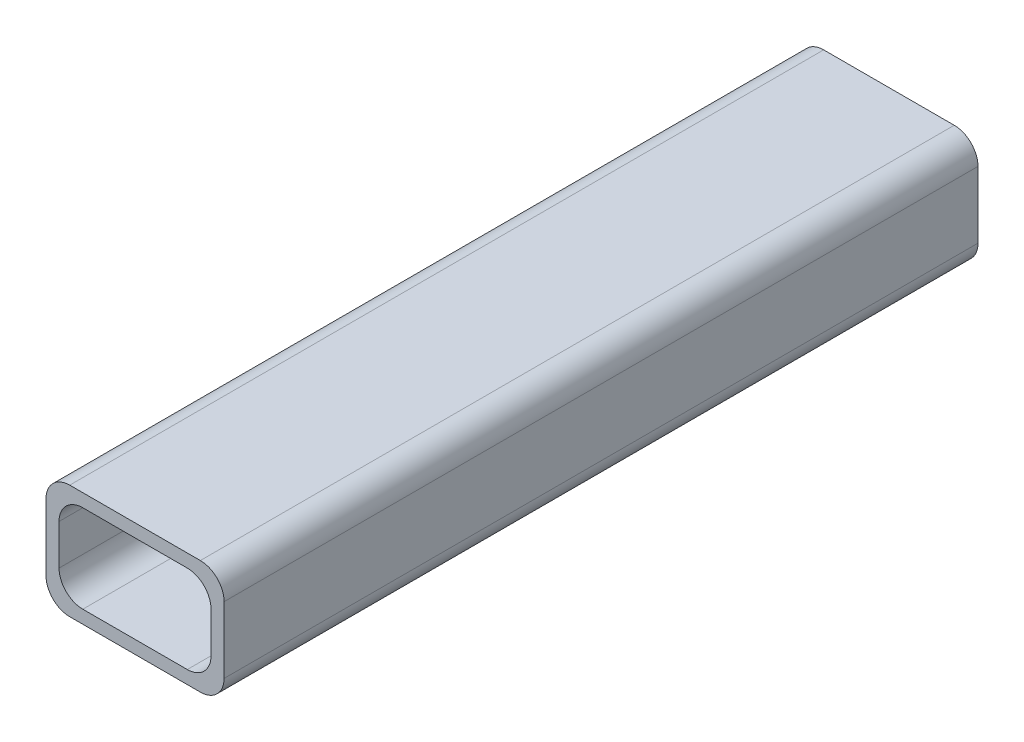
ISO-10303-21;
HEADER;
FILE_DESCRIPTION(('STEP AP214'),'2;1');
FILE_NAME('part.step','',(''),(''),'','','');
FILE_SCHEMA(('AUTOMOTIVE_DESIGN { 1 0 10303 214 1 1 1 1 }'));
ENDSEC;
DATA;
#1=APPLICATION_CONTEXT('core data for automotive mechanical design processes');
#2=APPLICATION_PROTOCOL_DEFINITION('international standard','automotive_design',2000,#1);
#3=PRODUCT_CONTEXT('',#1,'mechanical');
#4=PRODUCT('Part','Part','',(#3));
#5=PRODUCT_RELATED_PRODUCT_CATEGORY('part','',(#4));
#6=PRODUCT_DEFINITION_FORMATION('','',#4);
#7=PRODUCT_DEFINITION_CONTEXT('part definition',#1,'design');
#8=PRODUCT_DEFINITION('design','',#6,#7);
#9=PRODUCT_DEFINITION_SHAPE('','',#8);
#10=(LENGTH_UNIT() NAMED_UNIT(*) SI_UNIT(.MILLI.,.METRE.));
#11=(NAMED_UNIT(*) PLANE_ANGLE_UNIT() SI_UNIT($,.RADIAN.));
#12=(NAMED_UNIT(*) SI_UNIT($,.STERADIAN.) SOLID_ANGLE_UNIT());
#13=UNCERTAINTY_MEASURE_WITH_UNIT(LENGTH_MEASURE(1.E-05),#10,'distance_accuracy_value','');
#14=(GEOMETRIC_REPRESENTATION_CONTEXT(3) GLOBAL_UNCERTAINTY_ASSIGNED_CONTEXT((#13)) GLOBAL_UNIT_ASSIGNED_CONTEXT((#10,
#11,#12)) REPRESENTATION_CONTEXT('',''));
#15=CARTESIAN_POINT('',(0.,0.,0.));
#16=DIRECTION('',(0.,0.,1.));
#17=DIRECTION('',(1.,0.,0.));
#18=AXIS2_PLACEMENT_3D('',#15,#16,#17);
#19=CARTESIAN_POINT('',(15.,-9.6,-63.5));
#20=DIRECTION('',(1.,0.,0.));
#21=DIRECTION('',(0.,0.,-1.));
#22=AXIS2_PLACEMENT_3D('',#19,#20,#21);
#23=PLANE('',#22);
#24=DIRECTION('',(0.,1.,0.));
#25=VECTOR('',#24,1.);
#26=CARTESIAN_POINT('',(15.,-9.6,63.5));
#27=LINE('',#26,#25);
#28=CARTESIAN_POINT('',(15.,-5.6,63.5));
#29=VERTEX_POINT('',#28);
#30=CARTESIAN_POINT('',(15.,5.6,63.5));
#31=VERTEX_POINT('',#30);
#32=EDGE_CURVE('E173',#29,#31,#27,.T.);
#33=ORIENTED_EDGE('',*,*,#32,.F.);
#34=DIRECTION('',(0.,0.,1.));
#35=VECTOR('',#34,1.);
#36=CARTESIAN_POINT('',(15.,-5.6,-63.5));
#37=LINE('',#36,#35);
#38=CARTESIAN_POINT('',(15.,-5.6,-63.5));
#39=VERTEX_POINT('',#38);
#40=EDGE_CURVE('E254',#29,#39,#37,.F.);
#41=ORIENTED_EDGE('',*,*,#40,.T.);
#42=DIRECTION('',(0.,1.,0.));
#43=VECTOR('',#42,1.);
#44=CARTESIAN_POINT('',(15.,-9.6,-63.5));
#45=LINE('',#44,#43);
#46=CARTESIAN_POINT('',(15.,5.6,-63.5));
#47=VERTEX_POINT('',#46);
#48=EDGE_CURVE('E201',#39,#47,#45,.T.);
#49=ORIENTED_EDGE('',*,*,#48,.T.);
#50=DIRECTION('',(0.,0.,1.));
#51=VECTOR('',#50,1.);
#52=CARTESIAN_POINT('',(15.,5.6,-63.5));
#53=LINE('',#52,#51);
#54=EDGE_CURVE('E251',#47,#31,#53,.T.);
#55=ORIENTED_EDGE('',*,*,#54,.T.);
#56=EDGE_LOOP('',(#33,#41,#49,#55));
#57=FACE_BOUND('',#56,.T.);
#58=ADVANCED_FACE('F33',(#57),#23,.T.);
#59=CARTESIAN_POINT('',(-15.,-9.6,-63.5));
#60=DIRECTION('',(0.,-1.,0.));
#61=DIRECTION('',(0.,0.,-1.));
#62=AXIS2_PLACEMENT_3D('',#59,#60,#61);
#63=PLANE('',#62);
#64=DIRECTION('',(1.,0.,0.));
#65=VECTOR('',#64,1.);
#66=CARTESIAN_POINT('',(-15.,-9.6,63.5));
#67=LINE('',#66,#65);
#68=CARTESIAN_POINT('',(-11.,-9.6,63.5));
#69=VERTEX_POINT('',#68);
#70=CARTESIAN_POINT('',(11.,-9.6,63.5));
#71=VERTEX_POINT('',#70);
#72=EDGE_CURVE('E188',#69,#71,#67,.T.);
#73=ORIENTED_EDGE('',*,*,#72,.F.);
#74=DIRECTION('',(0.,0.,1.));
#75=VECTOR('',#74,1.);
#76=CARTESIAN_POINT('',(-11.,-9.6,-63.5));
#77=LINE('',#76,#75);
#78=CARTESIAN_POINT('',(-11.,-9.6,-63.5));
#79=VERTEX_POINT('',#78);
#80=EDGE_CURVE('E242',#69,#79,#77,.F.);
#81=ORIENTED_EDGE('',*,*,#80,.T.);
#82=DIRECTION('',(1.,0.,0.));
#83=VECTOR('',#82,1.);
#84=CARTESIAN_POINT('',(-15.,-9.6,-63.5));
#85=LINE('',#84,#83);
#86=CARTESIAN_POINT('',(11.,-9.6,-63.5));
#87=VERTEX_POINT('',#86);
#88=EDGE_CURVE('E209',#79,#87,#85,.T.);
#89=ORIENTED_EDGE('',*,*,#88,.T.);
#90=DIRECTION('',(0.,0.,1.));
#91=VECTOR('',#90,1.);
#92=CARTESIAN_POINT('',(11.,-9.6,-63.5));
#93=LINE('',#92,#91);
#94=EDGE_CURVE('E239',#87,#71,#93,.T.);
#95=ORIENTED_EDGE('',*,*,#94,.T.);
#96=EDGE_LOOP('',(#73,#81,#89,#95));
#97=FACE_BOUND('',#96,.T.);
#98=ADVANCED_FACE('F294',(#97),#63,.T.);
#99=CARTESIAN_POINT('',(-15.,-9.6,-63.5));
#100=DIRECTION('',(-1.,0.,0.));
#101=DIRECTION('',(0.,0.,1.));
#102=AXIS2_PLACEMENT_3D('',#99,#100,#101);
#103=PLANE('',#102);
#104=DIRECTION('',(0.,-1.,0.));
#105=VECTOR('',#104,1.);
#106=CARTESIAN_POINT('',(-15.,-9.6,-63.5));
#107=LINE('',#106,#105);
#108=CARTESIAN_POINT('',(-15.,5.6,-63.5));
#109=VERTEX_POINT('',#108);
#110=CARTESIAN_POINT('',(-15.,-5.6,-63.5));
#111=VERTEX_POINT('',#110);
#112=EDGE_CURVE('E206',#109,#111,#107,.T.);
#113=ORIENTED_EDGE('',*,*,#112,.T.);
#114=DIRECTION('',(0.,0.,1.));
#115=VECTOR('',#114,1.);
#116=CARTESIAN_POINT('',(-15.,-5.6,-63.5));
#117=LINE('',#116,#115);
#118=CARTESIAN_POINT('',(-15.,-5.6,63.5));
#119=VERTEX_POINT('',#118);
#120=EDGE_CURVE('E228',#111,#119,#117,.T.);
#121=ORIENTED_EDGE('',*,*,#120,.T.);
#122=DIRECTION('',(0.,-1.,0.));
#123=VECTOR('',#122,1.);
#124=CARTESIAN_POINT('',(-15.,-9.6,63.5));
#125=LINE('',#124,#123);
#126=CARTESIAN_POINT('',(-15.,5.6,63.5));
#127=VERTEX_POINT('',#126);
#128=EDGE_CURVE('E185',#127,#119,#125,.T.);
#129=ORIENTED_EDGE('',*,*,#128,.F.);
#130=DIRECTION('',(0.,0.,1.));
#131=VECTOR('',#130,1.);
#132=CARTESIAN_POINT('',(-15.,5.6,-63.5));
#133=LINE('',#132,#131);
#134=EDGE_CURVE('E226',#127,#109,#133,.F.);
#135=ORIENTED_EDGE('',*,*,#134,.T.);
#136=EDGE_LOOP('',(#113,#121,#129,#135));
#137=FACE_BOUND('',#136,.T.);
#138=ADVANCED_FACE('F300',(#137),#103,.T.);
#139=CARTESIAN_POINT('',(-15.,9.6,-63.5));
#140=DIRECTION('',(0.,1.,0.));
#141=DIRECTION('',(0.,0.,1.));
#142=AXIS2_PLACEMENT_3D('',#139,#140,#141);
#143=PLANE('',#142);
#144=DIRECTION('',(-1.,0.,0.));
#145=VECTOR('',#144,1.);
#146=CARTESIAN_POINT('',(-15.,9.6,63.5));
#147=LINE('',#146,#145);
#148=CARTESIAN_POINT('',(11.,9.6,63.5));
#149=VERTEX_POINT('',#148);
#150=CARTESIAN_POINT('',(-11.,9.6,63.5));
#151=VERTEX_POINT('',#150);
#152=EDGE_CURVE('E177',#149,#151,#147,.T.);
#153=ORIENTED_EDGE('',*,*,#152,.F.);
#154=DIRECTION('',(0.,0.,1.));
#155=VECTOR('',#154,1.);
#156=CARTESIAN_POINT('',(11.,9.6,-63.5));
#157=LINE('',#156,#155);
#158=CARTESIAN_POINT('',(11.,9.6,-63.5));
#159=VERTEX_POINT('',#158);
#160=EDGE_CURVE('E55',#149,#159,#157,.F.);
#161=ORIENTED_EDGE('',*,*,#160,.T.);
#162=DIRECTION('',(-1.,0.,0.));
#163=VECTOR('',#162,1.);
#164=CARTESIAN_POINT('',(-15.,9.6,-63.5));
#165=LINE('',#164,#163);
#166=CARTESIAN_POINT('',(-11.,9.6,-63.5));
#167=VERTEX_POINT('',#166);
#168=EDGE_CURVE('E204',#159,#167,#165,.T.);
#169=ORIENTED_EDGE('',*,*,#168,.T.);
#170=DIRECTION('',(0.,0.,1.));
#171=VECTOR('',#170,1.);
#172=CARTESIAN_POINT('',(-11.,9.6,-63.5));
#173=LINE('',#172,#171);
#174=EDGE_CURVE('E256',#167,#151,#173,.T.);
#175=ORIENTED_EDGE('',*,*,#174,.T.);
#176=EDGE_LOOP('',(#153,#161,#169,#175));
#177=FACE_BOUND('',#176,.T.);
#178=ADVANCED_FACE('F306',(#177),#143,.T.);
#179=CARTESIAN_POINT('',(0.,0.,-63.5));
#180=DIRECTION('',(0.,0.,-1.));
#181=DIRECTION('',(-1.,0.,0.));
#182=AXIS2_PLACEMENT_3D('',#179,#180,#181);
#183=PLANE('',#182);
#184=DIRECTION('',(1.,0.,0.));
#185=VECTOR('',#184,1.);
#186=CARTESIAN_POINT('',(-12.8,-7.4,-63.5));
#187=LINE('',#186,#185);
#188=CARTESIAN_POINT('',(-8.8,-7.4,-63.5));
#189=VERTEX_POINT('',#188);
#190=CARTESIAN_POINT('',(8.8,-7.4,-63.5));
#191=VERTEX_POINT('',#190);
#192=EDGE_CURVE('E166',#189,#191,#187,.T.);
#193=ORIENTED_EDGE('',*,*,#192,.T.);
#194=CARTESIAN_POINT('',(8.8,-3.4,-63.5));
#195=DIRECTION('',(0.,0.,-1.));
#196=DIRECTION('',(-1.,0.,0.));
#197=AXIS2_PLACEMENT_3D('',#194,#195,#196);
#198=CIRCLE('',#197,4.);
#199=CARTESIAN_POINT('',(12.8,-3.4,-63.5));
#200=VERTEX_POINT('',#199);
#201=EDGE_CURVE('E262',#191,#200,#198,.F.);
#202=ORIENTED_EDGE('',*,*,#201,.T.);
#203=DIRECTION('',(0.,1.,0.));
#204=VECTOR('',#203,1.);
#205=CARTESIAN_POINT('',(12.8,-7.4,-63.5));
#206=LINE('',#205,#204);
#207=CARTESIAN_POINT('',(12.8,3.4,-63.5));
#208=VERTEX_POINT('',#207);
#209=EDGE_CURVE('E191',#200,#208,#206,.T.);
#210=ORIENTED_EDGE('',*,*,#209,.T.);
#211=CARTESIAN_POINT('',(8.8,3.4,-63.5));
#212=DIRECTION('',(0.,0.,-1.));
#213=DIRECTION('',(-1.,0.,0.));
#214=AXIS2_PLACEMENT_3D('',#211,#212,#213);
#215=CIRCLE('',#214,4.);
#216=CARTESIAN_POINT('',(8.8,7.4,-63.5));
#217=VERTEX_POINT('',#216);
#218=EDGE_CURVE('E266',#208,#217,#215,.F.);
#219=ORIENTED_EDGE('',*,*,#218,.T.);
#220=DIRECTION('',(-1.,0.,0.));
#221=VECTOR('',#220,1.);
#222=CARTESIAN_POINT('',(-12.8,7.4,-63.5));
#223=LINE('',#222,#221);
#224=CARTESIAN_POINT('',(-8.8,7.4,-63.5));
#225=VERTEX_POINT('',#224);
#226=EDGE_CURVE('E194',#217,#225,#223,.T.);
#227=ORIENTED_EDGE('',*,*,#226,.T.);
#228=CARTESIAN_POINT('',(-8.8,3.4,-63.5));
#229=DIRECTION('',(0.,0.,-1.));
#230=DIRECTION('',(-1.,0.,0.));
#231=AXIS2_PLACEMENT_3D('',#228,#229,#230);
#232=CIRCLE('',#231,4.);
#233=CARTESIAN_POINT('',(-12.8,3.4,-63.5));
#234=VERTEX_POINT('',#233);
#235=EDGE_CURVE('E11',#225,#234,#232,.F.);
#236=ORIENTED_EDGE('',*,*,#235,.T.);
#237=DIRECTION('',(0.,-1.,0.));
#238=VECTOR('',#237,1.);
#239=CARTESIAN_POINT('',(-12.8,-7.4,-63.5));
#240=LINE('',#239,#238);
#241=CARTESIAN_POINT('',(-12.8,-3.4,-63.5));
#242=VERTEX_POINT('',#241);
#243=EDGE_CURVE('E197',#234,#242,#240,.T.);
#244=ORIENTED_EDGE('',*,*,#243,.T.);
#245=CARTESIAN_POINT('',(-8.8,-3.4,-63.5));
#246=DIRECTION('',(0.,0.,-1.));
#247=DIRECTION('',(-1.,0.,0.));
#248=AXIS2_PLACEMENT_3D('',#245,#246,#247);
#249=CIRCLE('',#248,4.);
#250=EDGE_CURVE('E157',#242,#189,#249,.F.);
#251=ORIENTED_EDGE('',*,*,#250,.T.);
#252=EDGE_LOOP('',(#193,#202,#210,#219,#227,#236,#244,#251));
#253=FACE_BOUND('',#252,.T.);
#254=ORIENTED_EDGE('',*,*,#88,.F.);
#255=CARTESIAN_POINT('',(-11.,-5.6,-63.5));
#256=DIRECTION('',(0.,0.,-1.));
#257=DIRECTION('',(-1.,0.,0.));
#258=AXIS2_PLACEMENT_3D('',#255,#256,#257);
#259=CIRCLE('',#258,4.);
#260=EDGE_CURVE('E249',#79,#111,#259,.T.);
#261=ORIENTED_EDGE('',*,*,#260,.T.);
#262=ORIENTED_EDGE('',*,*,#112,.F.);
#263=CARTESIAN_POINT('',(-11.,5.6,-63.5));
#264=DIRECTION('',(0.,0.,-1.));
#265=DIRECTION('',(-1.,0.,0.));
#266=AXIS2_PLACEMENT_3D('',#263,#264,#265);
#267=CIRCLE('',#266,4.);
#268=EDGE_CURVE('E48',#109,#167,#267,.T.);
#269=ORIENTED_EDGE('',*,*,#268,.T.);
#270=ORIENTED_EDGE('',*,*,#168,.F.);
#271=CARTESIAN_POINT('',(11.,5.6,-63.5));
#272=DIRECTION('',(0.,0.,-1.));
#273=DIRECTION('',(-1.,0.,0.));
#274=AXIS2_PLACEMENT_3D('',#271,#272,#273);
#275=CIRCLE('',#274,4.);
#276=EDGE_CURVE('E245',#159,#47,#275,.T.);
#277=ORIENTED_EDGE('',*,*,#276,.T.);
#278=ORIENTED_EDGE('',*,*,#48,.F.);
#279=CARTESIAN_POINT('',(11.,-5.6,-63.5));
#280=DIRECTION('',(0.,0.,-1.));
#281=DIRECTION('',(-1.,0.,0.));
#282=AXIS2_PLACEMENT_3D('',#279,#280,#281);
#283=CIRCLE('',#282,4.);
#284=EDGE_CURVE('E247',#39,#87,#283,.T.);
#285=ORIENTED_EDGE('',*,*,#284,.T.);
#286=EDGE_LOOP('',(#254,#261,#262,#269,#270,#277,#278,#285));
#287=FACE_BOUND('',#286,.T.);
#288=ADVANCED_FACE('F281',(#253,#287),#183,.T.);
#289=CARTESIAN_POINT('',(12.8,-7.4,-63.5));
#290=DIRECTION('',(1.,0.,0.));
#291=DIRECTION('',(0.,0.,-1.));
#292=AXIS2_PLACEMENT_3D('',#289,#290,#291);
#293=PLANE('',#292);
#294=ORIENTED_EDGE('',*,*,#209,.F.);
#295=DIRECTION('',(0.,0.,1.));
#296=VECTOR('',#295,1.);
#297=CARTESIAN_POINT('',(12.8,-3.4,63.5));
#298=LINE('',#297,#296);
#299=CARTESIAN_POINT('',(12.8,-3.4,63.5));
#300=VERTEX_POINT('',#299);
#301=EDGE_CURVE('E218',#200,#300,#298,.T.);
#302=ORIENTED_EDGE('',*,*,#301,.T.);
#303=DIRECTION('',(0.,1.,0.));
#304=VECTOR('',#303,1.);
#305=CARTESIAN_POINT('',(12.8,-7.4,63.5));
#306=LINE('',#305,#304);
#307=CARTESIAN_POINT('',(12.8,3.4,63.5));
#308=VERTEX_POINT('',#307);
#309=EDGE_CURVE('E276',#300,#308,#306,.T.);
#310=ORIENTED_EDGE('',*,*,#309,.T.);
#311=DIRECTION('',(0.,0.,1.));
#312=VECTOR('',#311,1.);
#313=CARTESIAN_POINT('',(12.8,3.4,-63.5));
#314=LINE('',#313,#312);
#315=EDGE_CURVE('E216',#308,#208,#314,.F.);
#316=ORIENTED_EDGE('',*,*,#315,.T.);
#317=EDGE_LOOP('',(#294,#302,#310,#316));
#318=FACE_BOUND('',#317,.T.);
#319=ADVANCED_FACE('F291',(#318),#293,.F.);
#320=CARTESIAN_POINT('',(-12.8,-7.4,-63.5));
#321=DIRECTION('',(0.,-1.,0.));
#322=DIRECTION('',(0.,0.,-1.));
#323=AXIS2_PLACEMENT_3D('',#320,#321,#322);
#324=PLANE('',#323);
#325=ORIENTED_EDGE('',*,*,#192,.F.);
#326=DIRECTION('',(0.,0.,1.));
#327=VECTOR('',#326,1.);
#328=CARTESIAN_POINT('',(-8.8,-7.4,63.5));
#329=LINE('',#328,#327);
#330=CARTESIAN_POINT('',(-8.8,-7.4,63.5));
#331=VERTEX_POINT('',#330);
#332=EDGE_CURVE('E151',#189,#331,#329,.T.);
#333=ORIENTED_EDGE('',*,*,#332,.T.);
#334=DIRECTION('',(1.,0.,0.));
#335=VECTOR('',#334,1.);
#336=CARTESIAN_POINT('',(-12.8,-7.4,63.5));
#337=LINE('',#336,#335);
#338=CARTESIAN_POINT('',(8.8,-7.4,63.5));
#339=VERTEX_POINT('',#338);
#340=EDGE_CURVE('E163',#331,#339,#337,.T.);
#341=ORIENTED_EDGE('',*,*,#340,.T.);
#342=DIRECTION('',(0.,0.,1.));
#343=VECTOR('',#342,1.);
#344=CARTESIAN_POINT('',(8.8,-7.4,-63.5));
#345=LINE('',#344,#343);
#346=EDGE_CURVE('E168',#339,#191,#345,.F.);
#347=ORIENTED_EDGE('',*,*,#346,.T.);
#348=EDGE_LOOP('',(#325,#333,#341,#347));
#349=FACE_BOUND('',#348,.T.);
#350=ADVANCED_FACE('F162',(#349),#324,.F.);
#351=CARTESIAN_POINT('',(-12.8,-7.4,-63.5));
#352=DIRECTION('',(-1.,0.,0.));
#353=DIRECTION('',(0.,0.,1.));
#354=AXIS2_PLACEMENT_3D('',#351,#352,#353);
#355=PLANE('',#354);
#356=DIRECTION('',(0.,-1.,0.));
#357=VECTOR('',#356,1.);
#358=CARTESIAN_POINT('',(-12.8,-7.4,63.5));
#359=LINE('',#358,#357);
#360=CARTESIAN_POINT('',(-12.8,3.4,63.5));
#361=VERTEX_POINT('',#360);
#362=CARTESIAN_POINT('',(-12.8,-3.4,63.5));
#363=VERTEX_POINT('',#362);
#364=EDGE_CURVE('E174',#361,#363,#359,.T.);
#365=ORIENTED_EDGE('',*,*,#364,.T.);
#366=DIRECTION('',(0.,0.,1.));
#367=VECTOR('',#366,1.);
#368=CARTESIAN_POINT('',(-12.8,-3.4,-63.5));
#369=LINE('',#368,#367);
#370=EDGE_CURVE('E152',#363,#242,#369,.F.);
#371=ORIENTED_EDGE('',*,*,#370,.T.);
#372=ORIENTED_EDGE('',*,*,#243,.F.);
#373=DIRECTION('',(0.,0.,1.));
#374=VECTOR('',#373,1.);
#375=CARTESIAN_POINT('',(-12.8,3.4,63.5));
#376=LINE('',#375,#374);
#377=EDGE_CURVE('E167',#234,#361,#376,.T.);
#378=ORIENTED_EDGE('',*,*,#377,.T.);
#379=EDGE_LOOP('',(#365,#371,#372,#378));
#380=FACE_BOUND('',#379,.T.);
#381=ADVANCED_FACE('F283',(#380),#355,.F.);
#382=CARTESIAN_POINT('',(-12.8,7.4,-63.5));
#383=DIRECTION('',(0.,1.,0.));
#384=DIRECTION('',(0.,0.,1.));
#385=AXIS2_PLACEMENT_3D('',#382,#383,#384);
#386=PLANE('',#385);
#387=ORIENTED_EDGE('',*,*,#226,.F.);
#388=DIRECTION('',(0.,0.,1.));
#389=VECTOR('',#388,1.);
#390=CARTESIAN_POINT('',(8.8,7.4,63.5));
#391=LINE('',#390,#389);
#392=CARTESIAN_POINT('',(8.8,7.4,63.5));
#393=VERTEX_POINT('',#392);
#394=EDGE_CURVE('E223',#217,#393,#391,.T.);
#395=ORIENTED_EDGE('',*,*,#394,.T.);
#396=DIRECTION('',(-1.,0.,0.));
#397=VECTOR('',#396,1.);
#398=CARTESIAN_POINT('',(-12.8,7.4,63.5));
#399=LINE('',#398,#397);
#400=CARTESIAN_POINT('',(-8.8,7.4,63.5));
#401=VERTEX_POINT('',#400);
#402=EDGE_CURVE('E179',#393,#401,#399,.T.);
#403=ORIENTED_EDGE('',*,*,#402,.T.);
#404=DIRECTION('',(0.,0.,1.));
#405=VECTOR('',#404,1.);
#406=CARTESIAN_POINT('',(-8.8,7.4,-63.5));
#407=LINE('',#406,#405);
#408=EDGE_CURVE('E221',#401,#225,#407,.F.);
#409=ORIENTED_EDGE('',*,*,#408,.T.);
#410=EDGE_LOOP('',(#387,#395,#403,#409));
#411=FACE_BOUND('',#410,.T.);
#412=ADVANCED_FACE('F274',(#411),#386,.F.);
#413=CARTESIAN_POINT('',(0.,0.,63.5));
#414=DIRECTION('',(0.,0.,-1.));
#415=DIRECTION('',(-1.,0.,0.));
#416=AXIS2_PLACEMENT_3D('',#413,#414,#415);
#417=PLANE('',#416);
#418=ORIENTED_EDGE('',*,*,#128,.T.);
#419=CARTESIAN_POINT('',(-11.,-5.6,63.5));
#420=DIRECTION('',(0.,0.,-1.));
#421=DIRECTION('',(-1.,0.,0.));
#422=AXIS2_PLACEMENT_3D('',#419,#420,#421);
#423=CIRCLE('',#422,4.);
#424=EDGE_CURVE('E237',#119,#69,#423,.F.);
#425=ORIENTED_EDGE('',*,*,#424,.T.);
#426=ORIENTED_EDGE('',*,*,#72,.T.);
#427=CARTESIAN_POINT('',(11.,-5.6,63.5));
#428=DIRECTION('',(0.,0.,-1.));
#429=DIRECTION('',(-1.,0.,0.));
#430=AXIS2_PLACEMENT_3D('',#427,#428,#429);
#431=CIRCLE('',#430,4.);
#432=EDGE_CURVE('E235',#71,#29,#431,.F.);
#433=ORIENTED_EDGE('',*,*,#432,.T.);
#434=ORIENTED_EDGE('',*,*,#32,.T.);
#435=CARTESIAN_POINT('',(11.,5.6,63.5));
#436=DIRECTION('',(0.,0.,-1.));
#437=DIRECTION('',(-1.,0.,0.));
#438=AXIS2_PLACEMENT_3D('',#435,#436,#437);
#439=CIRCLE('',#438,4.);
#440=EDGE_CURVE('E233',#31,#149,#439,.F.);
#441=ORIENTED_EDGE('',*,*,#440,.T.);
#442=ORIENTED_EDGE('',*,*,#152,.T.);
#443=CARTESIAN_POINT('',(-11.,5.6,63.5));
#444=DIRECTION('',(0.,0.,-1.));
#445=DIRECTION('',(-1.,0.,0.));
#446=AXIS2_PLACEMENT_3D('',#443,#444,#445);
#447=CIRCLE('',#446,4.);
#448=EDGE_CURVE('E231',#151,#127,#447,.F.);
#449=ORIENTED_EDGE('',*,*,#448,.T.);
#450=EDGE_LOOP('',(#418,#425,#426,#433,#434,#441,#442,#449));
#451=FACE_BOUND('',#450,.T.);
#452=ORIENTED_EDGE('',*,*,#309,.F.);
#453=CARTESIAN_POINT('',(8.8,-3.4,63.5));
#454=DIRECTION('',(0.,0.,-1.));
#455=DIRECTION('',(-1.,0.,0.));
#456=AXIS2_PLACEMENT_3D('',#453,#454,#455);
#457=CIRCLE('',#456,4.);
#458=EDGE_CURVE('E172',#300,#339,#457,.T.);
#459=ORIENTED_EDGE('',*,*,#458,.T.);
#460=ORIENTED_EDGE('',*,*,#340,.F.);
#461=CARTESIAN_POINT('',(-8.8,-3.4,63.5));
#462=DIRECTION('',(0.,0.,-1.));
#463=DIRECTION('',(-1.,0.,0.));
#464=AXIS2_PLACEMENT_3D('',#461,#462,#463);
#465=CIRCLE('',#464,4.);
#466=EDGE_CURVE('E147',#331,#363,#465,.T.);
#467=ORIENTED_EDGE('',*,*,#466,.T.);
#468=ORIENTED_EDGE('',*,*,#364,.F.);
#469=CARTESIAN_POINT('',(-8.8,3.4,63.5));
#470=DIRECTION('',(0.,0.,-1.));
#471=DIRECTION('',(-1.,0.,0.));
#472=AXIS2_PLACEMENT_3D('',#469,#470,#471);
#473=CIRCLE('',#472,4.);
#474=EDGE_CURVE('E41',#361,#401,#473,.T.);
#475=ORIENTED_EDGE('',*,*,#474,.T.);
#476=ORIENTED_EDGE('',*,*,#402,.F.);
#477=CARTESIAN_POINT('',(8.8,3.4,63.5));
#478=DIRECTION('',(0.,0.,-1.));
#479=DIRECTION('',(-1.,0.,0.));
#480=AXIS2_PLACEMENT_3D('',#477,#478,#479);
#481=CIRCLE('',#480,4.);
#482=EDGE_CURVE('E264',#393,#308,#481,.T.);
#483=ORIENTED_EDGE('',*,*,#482,.T.);
#484=EDGE_LOOP('',(#452,#459,#460,#467,#468,#475,#476,#483));
#485=FACE_BOUND('',#484,.T.);
#486=ADVANCED_FACE('F171',(#451,#485),#417,.F.);
#487=CARTESIAN_POINT('',(-8.8,-3.4,-63.5));
#488=DIRECTION('',(0.,0.,-1.));
#489=DIRECTION('',(-1.,0.,0.));
#490=AXIS2_PLACEMENT_3D('',#487,#488,#489);
#491=CYLINDRICAL_SURFACE('',#490,4.);
#492=ORIENTED_EDGE('',*,*,#250,.F.);
#493=ORIENTED_EDGE('',*,*,#370,.F.);
#494=ORIENTED_EDGE('',*,*,#466,.F.);
#495=ORIENTED_EDGE('',*,*,#332,.F.);
#496=EDGE_LOOP('',(#492,#493,#494,#495));
#497=FACE_BOUND('',#496,.T.);
#498=ADVANCED_FACE('F150',(#497),#491,.F.);
#499=CARTESIAN_POINT('',(8.8,-3.4,-63.5));
#500=DIRECTION('',(0.,0.,-1.));
#501=DIRECTION('',(-1.,0.,0.));
#502=AXIS2_PLACEMENT_3D('',#499,#500,#501);
#503=CYLINDRICAL_SURFACE('',#502,4.);
#504=ORIENTED_EDGE('',*,*,#201,.F.);
#505=ORIENTED_EDGE('',*,*,#346,.F.);
#506=ORIENTED_EDGE('',*,*,#458,.F.);
#507=ORIENTED_EDGE('',*,*,#301,.F.);
#508=EDGE_LOOP('',(#504,#505,#506,#507));
#509=FACE_BOUND('',#508,.T.);
#510=ADVANCED_FACE('F310',(#509),#503,.F.);
#511=CARTESIAN_POINT('',(8.8,3.4,-63.5));
#512=DIRECTION('',(0.,0.,-1.));
#513=DIRECTION('',(-1.,0.,0.));
#514=AXIS2_PLACEMENT_3D('',#511,#512,#513);
#515=CYLINDRICAL_SURFACE('',#514,4.);
#516=ORIENTED_EDGE('',*,*,#218,.F.);
#517=ORIENTED_EDGE('',*,*,#315,.F.);
#518=ORIENTED_EDGE('',*,*,#482,.F.);
#519=ORIENTED_EDGE('',*,*,#394,.F.);
#520=EDGE_LOOP('',(#516,#517,#518,#519));
#521=FACE_BOUND('',#520,.T.);
#522=ADVANCED_FACE('F313',(#521),#515,.F.);
#523=CARTESIAN_POINT('',(-8.8,3.4,-63.5));
#524=DIRECTION('',(0.,0.,-1.));
#525=DIRECTION('',(-1.,0.,0.));
#526=AXIS2_PLACEMENT_3D('',#523,#524,#525);
#527=CYLINDRICAL_SURFACE('',#526,4.);
#528=ORIENTED_EDGE('',*,*,#235,.F.);
#529=ORIENTED_EDGE('',*,*,#408,.F.);
#530=ORIENTED_EDGE('',*,*,#474,.F.);
#531=ORIENTED_EDGE('',*,*,#377,.F.);
#532=EDGE_LOOP('',(#528,#529,#530,#531));
#533=FACE_BOUND('',#532,.T.);
#534=ADVANCED_FACE('F278',(#533),#527,.F.);
#535=CARTESIAN_POINT('',(-11.,-5.6,-63.5));
#536=DIRECTION('',(0.,0.,1.));
#537=DIRECTION('',(1.,0.,0.));
#538=AXIS2_PLACEMENT_3D('',#535,#536,#537);
#539=CYLINDRICAL_SURFACE('',#538,4.);
#540=ORIENTED_EDGE('',*,*,#260,.F.);
#541=ORIENTED_EDGE('',*,*,#80,.F.);
#542=ORIENTED_EDGE('',*,*,#424,.F.);
#543=ORIENTED_EDGE('',*,*,#120,.F.);
#544=EDGE_LOOP('',(#540,#541,#542,#543));
#545=FACE_BOUND('',#544,.T.);
#546=ADVANCED_FACE('F320',(#545),#539,.T.);
#547=CARTESIAN_POINT('',(11.,-5.6,-63.5));
#548=DIRECTION('',(0.,0.,1.));
#549=DIRECTION('',(1.,0.,0.));
#550=AXIS2_PLACEMENT_3D('',#547,#548,#549);
#551=CYLINDRICAL_SURFACE('',#550,4.);
#552=ORIENTED_EDGE('',*,*,#284,.F.);
#553=ORIENTED_EDGE('',*,*,#40,.F.);
#554=ORIENTED_EDGE('',*,*,#432,.F.);
#555=ORIENTED_EDGE('',*,*,#94,.F.);
#556=EDGE_LOOP('',(#552,#553,#554,#555));
#557=FACE_BOUND('',#556,.T.);
#558=ADVANCED_FACE('F323',(#557),#551,.T.);
#559=CARTESIAN_POINT('',(11.,5.6,-63.5));
#560=DIRECTION('',(0.,0.,1.));
#561=DIRECTION('',(1.,0.,0.));
#562=AXIS2_PLACEMENT_3D('',#559,#560,#561);
#563=CYLINDRICAL_SURFACE('',#562,4.);
#564=ORIENTED_EDGE('',*,*,#276,.F.);
#565=ORIENTED_EDGE('',*,*,#160,.F.);
#566=ORIENTED_EDGE('',*,*,#440,.F.);
#567=ORIENTED_EDGE('',*,*,#54,.F.);
#568=EDGE_LOOP('',(#564,#565,#566,#567));
#569=FACE_BOUND('',#568,.T.);
#570=ADVANCED_FACE('F326',(#569),#563,.T.);
#571=CARTESIAN_POINT('',(-11.,5.6,-63.5));
#572=DIRECTION('',(0.,0.,1.));
#573=DIRECTION('',(1.,0.,0.));
#574=AXIS2_PLACEMENT_3D('',#571,#572,#573);
#575=CYLINDRICAL_SURFACE('',#574,4.);
#576=ORIENTED_EDGE('',*,*,#268,.F.);
#577=ORIENTED_EDGE('',*,*,#134,.F.);
#578=ORIENTED_EDGE('',*,*,#448,.F.);
#579=ORIENTED_EDGE('',*,*,#174,.F.);
#580=EDGE_LOOP('',(#576,#577,#578,#579));
#581=FACE_BOUND('',#580,.T.);
#582=ADVANCED_FACE('F35',(#581),#575,.T.);
#583=CLOSED_SHELL('',(#58,#98,#138,#178,#288,#319,#350,#381,#412,#486,#498,#510,#522,#534,#546,
#558,#570,#582));
#584=MANIFOLD_SOLID_BREP('B2',#583);
#585=ADVANCED_BREP_SHAPE_REPRESENTATION('',(#18,#584),#14);
#586=SHAPE_DEFINITION_REPRESENTATION(#9,#585);
ENDSEC;
END-ISO-10303-21;
